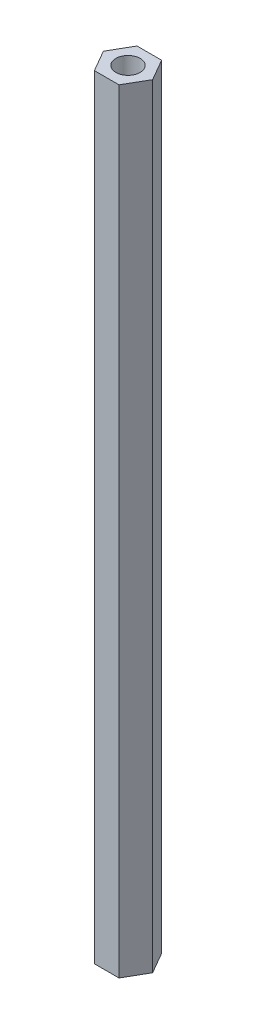
ISO-10303-21;
HEADER;
FILE_DESCRIPTION(('STEP AP214'),'2;1');
FILE_NAME('part.step','',(''),(''),'','','');
FILE_SCHEMA(('AUTOMOTIVE_DESIGN { 1 0 10303 214 1 1 1 1 }'));
ENDSEC;
DATA;
#1=APPLICATION_CONTEXT('core data for automotive mechanical design processes');
#2=APPLICATION_PROTOCOL_DEFINITION('international standard','automotive_design',2000,#1);
#3=PRODUCT_CONTEXT('',#1,'mechanical');
#4=PRODUCT('Part','Part','',(#3));
#5=PRODUCT_RELATED_PRODUCT_CATEGORY('part','',(#4));
#6=PRODUCT_DEFINITION_FORMATION('','',#4);
#7=PRODUCT_DEFINITION_CONTEXT('part definition',#1,'design');
#8=PRODUCT_DEFINITION('design','',#6,#7);
#9=PRODUCT_DEFINITION_SHAPE('','',#8);
#10=(LENGTH_UNIT() NAMED_UNIT(*) SI_UNIT(.MILLI.,.METRE.));
#11=(NAMED_UNIT(*) PLANE_ANGLE_UNIT() SI_UNIT($,.RADIAN.));
#12=(NAMED_UNIT(*) SI_UNIT($,.STERADIAN.) SOLID_ANGLE_UNIT());
#13=UNCERTAINTY_MEASURE_WITH_UNIT(LENGTH_MEASURE(1.E-05),#10,'distance_accuracy_value','');
#14=(GEOMETRIC_REPRESENTATION_CONTEXT(3) GLOBAL_UNCERTAINTY_ASSIGNED_CONTEXT((#13)) GLOBAL_UNIT_ASSIGNED_CONTEXT((#10,
#11,#12)) REPRESENTATION_CONTEXT('',''));
#15=CARTESIAN_POINT('',(0.,0.,0.));
#16=DIRECTION('',(0.,0.,1.));
#17=DIRECTION('',(1.,0.,0.));
#18=AXIS2_PLACEMENT_3D('',#15,#16,#17);
#19=CARTESIAN_POINT('',(0.,127.,0.));
#20=DIRECTION('',(0.,1.,0.));
#21=DIRECTION('',(0.,0.,1.));
#22=AXIS2_PLACEMENT_3D('',#19,#20,#21);
#23=PLANE('',#22);
#24=DIRECTION('',(-0.5,0.,-0.866025403784439));
#25=VECTOR('',#24,1.);
#26=CARTESIAN_POINT('',(4.04145188432738,127.,0.));
#27=LINE('',#26,#25);
#28=CARTESIAN_POINT('',(4.04145188432738,127.,0.));
#29=VERTEX_POINT('',#28);
#30=CARTESIAN_POINT('',(2.02072594216369,127.,-3.5));
#31=VERTEX_POINT('',#30);
#32=EDGE_CURVE('E141',#29,#31,#27,.T.);
#33=ORIENTED_EDGE('',*,*,#32,.T.);
#34=DIRECTION('',(-1.,0.,0.));
#35=VECTOR('',#34,1.);
#36=CARTESIAN_POINT('',(2.02072594216369,127.,-3.5));
#37=LINE('',#36,#35);
#38=CARTESIAN_POINT('',(-2.02072594216369,127.,-3.5));
#39=VERTEX_POINT('',#38);
#40=EDGE_CURVE('E99',#31,#39,#37,.T.);
#41=ORIENTED_EDGE('',*,*,#40,.T.);
#42=DIRECTION('',(-0.5,0.,0.866025403784439));
#43=VECTOR('',#42,1.);
#44=CARTESIAN_POINT('',(-2.02072594216369,127.,-3.5));
#45=LINE('',#44,#43);
#46=CARTESIAN_POINT('',(-4.04145188432738,127.,0.));
#47=VERTEX_POINT('',#46);
#48=EDGE_CURVE('E112',#39,#47,#45,.T.);
#49=ORIENTED_EDGE('',*,*,#48,.T.);
#50=DIRECTION('',(0.5,0.,0.866025403784439));
#51=VECTOR('',#50,1.);
#52=CARTESIAN_POINT('',(-4.04145188432738,127.,0.));
#53=LINE('',#52,#51);
#54=CARTESIAN_POINT('',(-2.02072594216369,127.,3.5));
#55=VERTEX_POINT('',#54);
#56=EDGE_CURVE('E106',#47,#55,#53,.T.);
#57=ORIENTED_EDGE('',*,*,#56,.T.);
#58=DIRECTION('',(1.,0.,0.));
#59=VECTOR('',#58,1.);
#60=CARTESIAN_POINT('',(-2.02072594216369,127.,3.5));
#61=LINE('',#60,#59);
#62=CARTESIAN_POINT('',(2.02072594216369,127.,3.5));
#63=VERTEX_POINT('',#62);
#64=EDGE_CURVE('E110',#55,#63,#61,.T.);
#65=ORIENTED_EDGE('',*,*,#64,.T.);
#66=DIRECTION('',(0.5,0.,-0.866025403784439));
#67=VECTOR('',#66,1.);
#68=CARTESIAN_POINT('',(2.02072594216369,127.,3.5));
#69=LINE('',#68,#67);
#70=EDGE_CURVE('E62',#63,#29,#69,.T.);
#71=ORIENTED_EDGE('',*,*,#70,.T.);
#72=EDGE_LOOP('',(#33,#41,#49,#57,#65,#71));
#73=FACE_BOUND('',#72,.T.);
#74=CARTESIAN_POINT('',(0.,127.,0.));
#75=DIRECTION('',(0.,1.,0.));
#76=DIRECTION('',(0.,0.,1.));
#77=AXIS2_PLACEMENT_3D('',#74,#75,#76);
#78=CIRCLE('',#77,2.);
#79=CARTESIAN_POINT('',(0.,127.,2.));
#80=VERTEX_POINT('',#79);
#81=EDGE_CURVE('E134',#80,#80,#78,.T.);
#82=ORIENTED_EDGE('',*,*,#81,.F.);
#83=EDGE_LOOP('',(#82));
#84=FACE_BOUND('',#83,.T.);
#85=ADVANCED_FACE('F45',(#73,#84),#23,.T.);
#86=CARTESIAN_POINT('',(0.,0.,0.));
#87=DIRECTION('',(0.,1.,0.));
#88=DIRECTION('',(0.,0.,1.));
#89=AXIS2_PLACEMENT_3D('',#86,#87,#88);
#90=PLANE('',#89);
#91=DIRECTION('',(-0.5,0.,-0.866025403784439));
#92=VECTOR('',#91,1.);
#93=CARTESIAN_POINT('',(4.04145188432738,0.,0.));
#94=LINE('',#93,#92);
#95=CARTESIAN_POINT('',(4.04145188432738,0.,0.));
#96=VERTEX_POINT('',#95);
#97=CARTESIAN_POINT('',(2.02072594216369,0.,-3.5));
#98=VERTEX_POINT('',#97);
#99=EDGE_CURVE('E130',#96,#98,#94,.T.);
#100=ORIENTED_EDGE('',*,*,#99,.F.);
#101=DIRECTION('',(0.5,0.,-0.866025403784439));
#102=VECTOR('',#101,1.);
#103=CARTESIAN_POINT('',(2.02072594216369,0.,3.5));
#104=LINE('',#103,#102);
#105=CARTESIAN_POINT('',(2.02072594216369,0.,3.5));
#106=VERTEX_POINT('',#105);
#107=EDGE_CURVE('E91',#106,#96,#104,.T.);
#108=ORIENTED_EDGE('',*,*,#107,.F.);
#109=DIRECTION('',(1.,0.,0.));
#110=VECTOR('',#109,1.);
#111=CARTESIAN_POINT('',(-2.02072594216369,0.,3.5));
#112=LINE('',#111,#110);
#113=CARTESIAN_POINT('',(-2.02072594216369,0.,3.5));
#114=VERTEX_POINT('',#113);
#115=EDGE_CURVE('E85',#114,#106,#112,.T.);
#116=ORIENTED_EDGE('',*,*,#115,.F.);
#117=DIRECTION('',(0.5,0.,0.866025403784439));
#118=VECTOR('',#117,1.);
#119=CARTESIAN_POINT('',(-4.04145188432738,0.,0.));
#120=LINE('',#119,#118);
#121=CARTESIAN_POINT('',(-4.04145188432738,0.,0.));
#122=VERTEX_POINT('',#121);
#123=EDGE_CURVE('E120',#122,#114,#120,.T.);
#124=ORIENTED_EDGE('',*,*,#123,.F.);
#125=DIRECTION('',(-0.5,0.,0.866025403784439));
#126=VECTOR('',#125,1.);
#127=CARTESIAN_POINT('',(-2.02072594216369,0.,-3.5));
#128=LINE('',#127,#126);
#129=CARTESIAN_POINT('',(-2.02072594216369,0.,-3.5));
#130=VERTEX_POINT('',#129);
#131=EDGE_CURVE('E136',#130,#122,#128,.T.);
#132=ORIENTED_EDGE('',*,*,#131,.F.);
#133=DIRECTION('',(-1.,0.,0.));
#134=VECTOR('',#133,1.);
#135=CARTESIAN_POINT('',(2.02072594216369,0.,-3.5));
#136=LINE('',#135,#134);
#137=EDGE_CURVE('E133',#98,#130,#136,.T.);
#138=ORIENTED_EDGE('',*,*,#137,.F.);
#139=EDGE_LOOP('',(#100,#108,#116,#124,#132,#138));
#140=FACE_BOUND('',#139,.T.);
#141=CARTESIAN_POINT('',(0.,0.,0.));
#142=DIRECTION('',(0.,1.,0.));
#143=DIRECTION('',(0.,0.,1.));
#144=AXIS2_PLACEMENT_3D('',#141,#142,#143);
#145=CIRCLE('',#144,2.);
#146=CARTESIAN_POINT('',(0.,0.,2.));
#147=VERTEX_POINT('',#146);
#148=EDGE_CURVE('E242',#147,#147,#145,.T.);
#149=ORIENTED_EDGE('',*,*,#148,.T.);
#150=EDGE_LOOP('',(#149));
#151=FACE_BOUND('',#150,.T.);
#152=ADVANCED_FACE('F150',(#140,#151),#90,.F.);
#153=CARTESIAN_POINT('',(4.04145188432738,127.,0.));
#154=DIRECTION('',(-0.866025403784439,0.,0.5));
#155=DIRECTION('',(0.5,0.,0.866025403784439));
#156=AXIS2_PLACEMENT_3D('',#153,#154,#155);
#157=PLANE('',#156);
#158=ORIENTED_EDGE('',*,*,#99,.T.);
#159=DIRECTION('',(0.,-1.,0.));
#160=VECTOR('',#159,1.);
#161=CARTESIAN_POINT('',(2.02072594216369,127.,-3.5));
#162=LINE('',#161,#160);
#163=EDGE_CURVE('E11',#31,#98,#162,.T.);
#164=ORIENTED_EDGE('',*,*,#163,.F.);
#165=ORIENTED_EDGE('',*,*,#32,.F.);
#166=DIRECTION('',(0.,-1.,0.));
#167=VECTOR('',#166,1.);
#168=CARTESIAN_POINT('',(4.04145188432738,127.,0.));
#169=LINE('',#168,#167);
#170=EDGE_CURVE('E126',#29,#96,#169,.T.);
#171=ORIENTED_EDGE('',*,*,#170,.T.);
#172=EDGE_LOOP('',(#158,#164,#165,#171));
#173=FACE_BOUND('',#172,.T.);
#174=ADVANCED_FACE('F47',(#173),#157,.F.);
#175=CARTESIAN_POINT('',(2.02072594216369,127.,-3.5));
#176=DIRECTION('',(0.,0.,1.));
#177=DIRECTION('',(1.,0.,0.));
#178=AXIS2_PLACEMENT_3D('',#175,#176,#177);
#179=PLANE('',#178);
#180=ORIENTED_EDGE('',*,*,#137,.T.);
#181=DIRECTION('',(0.,-1.,0.));
#182=VECTOR('',#181,1.);
#183=CARTESIAN_POINT('',(-2.02072594216369,127.,-3.5));
#184=LINE('',#183,#182);
#185=EDGE_CURVE('E54',#39,#130,#184,.T.);
#186=ORIENTED_EDGE('',*,*,#185,.F.);
#187=ORIENTED_EDGE('',*,*,#40,.F.);
#188=ORIENTED_EDGE('',*,*,#163,.T.);
#189=EDGE_LOOP('',(#180,#186,#187,#188));
#190=FACE_BOUND('',#189,.T.);
#191=ADVANCED_FACE('F176',(#190),#179,.F.);
#192=CARTESIAN_POINT('',(-2.02072594216369,127.,-3.5));
#193=DIRECTION('',(0.866025403784439,0.,0.5));
#194=DIRECTION('',(0.5,0.,-0.866025403784439));
#195=AXIS2_PLACEMENT_3D('',#192,#193,#194);
#196=PLANE('',#195);
#197=ORIENTED_EDGE('',*,*,#131,.T.);
#198=DIRECTION('',(0.,-1.,0.));
#199=VECTOR('',#198,1.);
#200=CARTESIAN_POINT('',(-4.04145188432738,127.,0.));
#201=LINE('',#200,#199);
#202=EDGE_CURVE('E121',#47,#122,#201,.T.);
#203=ORIENTED_EDGE('',*,*,#202,.F.);
#204=ORIENTED_EDGE('',*,*,#48,.F.);
#205=ORIENTED_EDGE('',*,*,#185,.T.);
#206=EDGE_LOOP('',(#197,#203,#204,#205));
#207=FACE_BOUND('',#206,.T.);
#208=ADVANCED_FACE('F147',(#207),#196,.F.);
#209=CARTESIAN_POINT('',(-4.04145188432738,127.,0.));
#210=DIRECTION('',(0.866025403784439,0.,-0.5));
#211=DIRECTION('',(-0.5,0.,-0.866025403784439));
#212=AXIS2_PLACEMENT_3D('',#209,#210,#211);
#213=PLANE('',#212);
#214=ORIENTED_EDGE('',*,*,#123,.T.);
#215=DIRECTION('',(0.,-1.,0.));
#216=VECTOR('',#215,1.);
#217=CARTESIAN_POINT('',(-2.02072594216369,127.,3.5));
#218=LINE('',#217,#216);
#219=EDGE_CURVE('E117',#55,#114,#218,.T.);
#220=ORIENTED_EDGE('',*,*,#219,.F.);
#221=ORIENTED_EDGE('',*,*,#56,.F.);
#222=ORIENTED_EDGE('',*,*,#202,.T.);
#223=EDGE_LOOP('',(#214,#220,#221,#222));
#224=FACE_BOUND('',#223,.T.);
#225=ADVANCED_FACE('F118',(#224),#213,.F.);
#226=CARTESIAN_POINT('',(-2.02072594216369,127.,3.5));
#227=DIRECTION('',(0.,0.,-1.));
#228=DIRECTION('',(-1.,0.,0.));
#229=AXIS2_PLACEMENT_3D('',#226,#227,#228);
#230=PLANE('',#229);
#231=ORIENTED_EDGE('',*,*,#115,.T.);
#232=DIRECTION('',(0.,-1.,0.));
#233=VECTOR('',#232,1.);
#234=CARTESIAN_POINT('',(2.02072594216369,127.,3.5));
#235=LINE('',#234,#233);
#236=EDGE_CURVE('E122',#63,#106,#235,.T.);
#237=ORIENTED_EDGE('',*,*,#236,.F.);
#238=ORIENTED_EDGE('',*,*,#64,.F.);
#239=ORIENTED_EDGE('',*,*,#219,.T.);
#240=EDGE_LOOP('',(#231,#237,#238,#239));
#241=FACE_BOUND('',#240,.T.);
#242=ADVANCED_FACE('F124',(#241),#230,.F.);
#243=CARTESIAN_POINT('',(2.02072594216369,127.,3.5));
#244=DIRECTION('',(-0.866025403784439,0.,-0.5));
#245=DIRECTION('',(-0.5,0.,0.866025403784439));
#246=AXIS2_PLACEMENT_3D('',#243,#244,#245);
#247=PLANE('',#246);
#248=ORIENTED_EDGE('',*,*,#107,.T.);
#249=ORIENTED_EDGE('',*,*,#170,.F.);
#250=ORIENTED_EDGE('',*,*,#70,.F.);
#251=ORIENTED_EDGE('',*,*,#236,.T.);
#252=EDGE_LOOP('',(#248,#249,#250,#251));
#253=FACE_BOUND('',#252,.T.);
#254=ADVANCED_FACE('F155',(#253),#247,.F.);
#255=CARTESIAN_POINT('',(0.,127.,0.));
#256=DIRECTION('',(0.,-1.,0.));
#257=DIRECTION('',(0.,0.,-1.));
#258=AXIS2_PLACEMENT_3D('',#255,#256,#257);
#259=CYLINDRICAL_SURFACE('',#258,2.);
#260=ORIENTED_EDGE('',*,*,#81,.T.);
#261=EDGE_LOOP('',(#260));
#262=FACE_BOUND('',#261,.T.);
#263=ORIENTED_EDGE('',*,*,#148,.F.);
#264=EDGE_LOOP('',(#263));
#265=FACE_BOUND('',#264,.T.);
#266=ADVANCED_FACE('F157',(#262,#265),#259,.F.);
#267=CLOSED_SHELL('',(#85,#152,#174,#191,#208,#225,#242,#254,#266));
#268=MANIFOLD_SOLID_BREP('B2',#267);
#269=ADVANCED_BREP_SHAPE_REPRESENTATION('',(#18,#268),#14);
#270=SHAPE_DEFINITION_REPRESENTATION(#9,#269);
ENDSEC;
END-ISO-10303-21;
